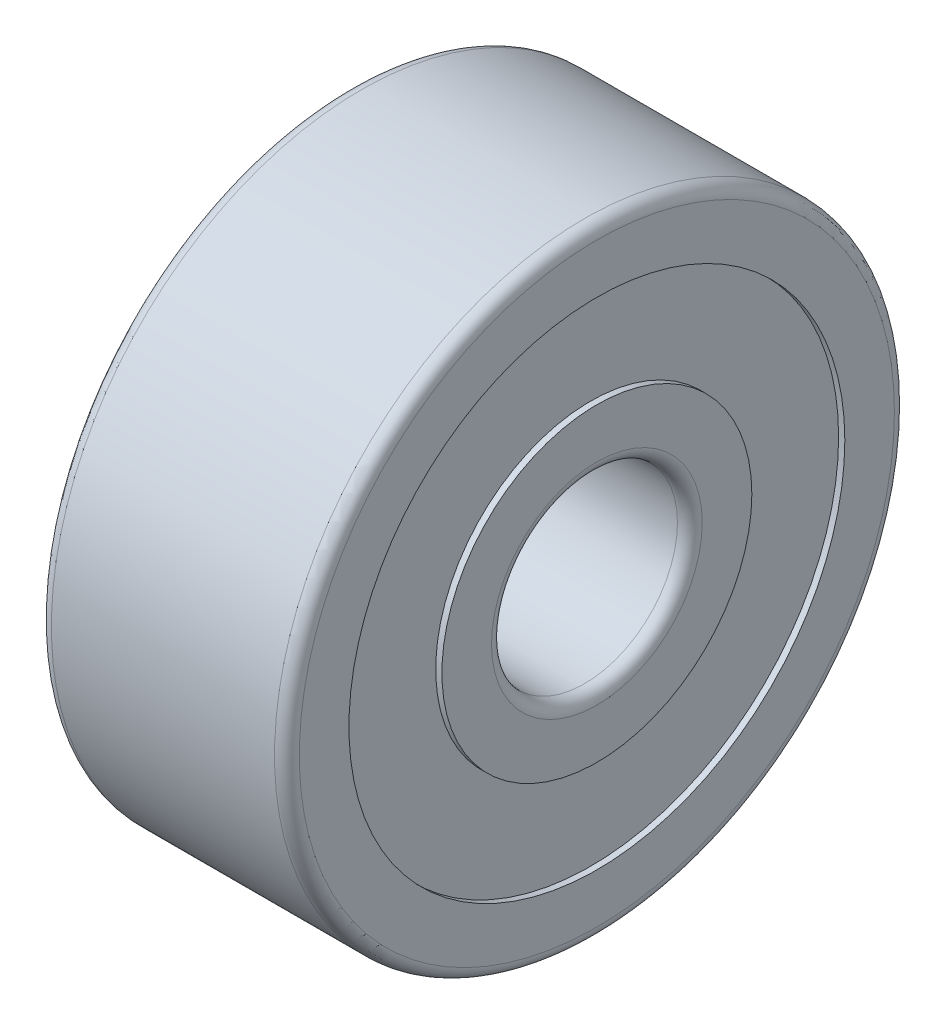
ISO-10303-21;
HEADER;
FILE_DESCRIPTION(('STEP AP214'),'2;1');
FILE_NAME('part.step','',(''),(''),'','','');
FILE_SCHEMA(('AUTOMOTIVE_DESIGN { 1 0 10303 214 1 1 1 1 }'));
ENDSEC;
DATA;
#1=APPLICATION_CONTEXT('core data for automotive mechanical design processes');
#2=APPLICATION_PROTOCOL_DEFINITION('international standard','automotive_design',2000,#1);
#3=PRODUCT_CONTEXT('',#1,'mechanical');
#4=PRODUCT('Part','Part','',(#3));
#5=PRODUCT_RELATED_PRODUCT_CATEGORY('part','',(#4));
#6=PRODUCT_DEFINITION_FORMATION('','',#4);
#7=PRODUCT_DEFINITION_CONTEXT('part definition',#1,'design');
#8=PRODUCT_DEFINITION('design','',#6,#7);
#9=PRODUCT_DEFINITION_SHAPE('','',#8);
#10=(LENGTH_UNIT() NAMED_UNIT(*) SI_UNIT(.MILLI.,.METRE.));
#11=(NAMED_UNIT(*) PLANE_ANGLE_UNIT() SI_UNIT($,.RADIAN.));
#12=(NAMED_UNIT(*) SI_UNIT($,.STERADIAN.) SOLID_ANGLE_UNIT());
#13=UNCERTAINTY_MEASURE_WITH_UNIT(LENGTH_MEASURE(1.E-05),#10,'distance_accuracy_value','');
#14=(GEOMETRIC_REPRESENTATION_CONTEXT(3) GLOBAL_UNCERTAINTY_ASSIGNED_CONTEXT((#13)) GLOBAL_UNIT_ASSIGNED_CONTEXT((#10,
#11,#12)) REPRESENTATION_CONTEXT('',''));
#15=CARTESIAN_POINT('',(0.,0.,0.));
#16=DIRECTION('',(0.,0.,1.));
#17=DIRECTION('',(1.,0.,0.));
#18=AXIS2_PLACEMENT_3D('',#15,#16,#17);
#19=CARTESIAN_POINT('',(-2.,0.,0.));
#20=DIRECTION('',(1.,0.,0.));
#21=DIRECTION('',(0.,0.,-1.));
#22=AXIS2_PLACEMENT_3D('',#19,#20,#21);
#23=PLANE('',#22);
#24=CARTESIAN_POINT('',(-2.,0.,0.));
#25=DIRECTION('',(1.,0.,0.));
#26=DIRECTION('',(0.,0.,-1.));
#27=AXIS2_PLACEMENT_3D('',#24,#25,#26);
#28=CIRCLE('',#27,1.7);
#29=CARTESIAN_POINT('',(-2.,0.,-1.7));
#30=VERTEX_POINT('',#29);
#31=EDGE_CURVE('E57',#30,#30,#28,.T.);
#32=ORIENTED_EDGE('',*,*,#31,.T.);
#33=EDGE_LOOP('',(#32));
#34=FACE_BOUND('',#33,.T.);
#35=CARTESIAN_POINT('',(-2.,0.,0.));
#36=DIRECTION('',(-1.,0.,0.));
#37=DIRECTION('',(0.,0.,1.));
#38=AXIS2_PLACEMENT_3D('',#35,#36,#37);
#39=CIRCLE('',#38,2.5);
#40=CARTESIAN_POINT('',(-2.,0.,2.5));
#41=VERTEX_POINT('',#40);
#42=EDGE_CURVE('E82',#41,#41,#39,.T.);
#43=ORIENTED_EDGE('',*,*,#42,.T.);
#44=EDGE_LOOP('',(#43));
#45=FACE_BOUND('',#44,.T.);
#46=ADVANCED_FACE('F31',(#34,#45),#23,.F.);
#47=CARTESIAN_POINT('',(2.,0.,0.));
#48=DIRECTION('',(1.,0.,0.));
#49=DIRECTION('',(0.,0.,-1.));
#50=AXIS2_PLACEMENT_3D('',#47,#48,#49);
#51=PLANE('',#50);
#52=CARTESIAN_POINT('',(2.,0.,0.));
#53=DIRECTION('',(1.,0.,0.));
#54=DIRECTION('',(0.,0.,-1.));
#55=AXIS2_PLACEMENT_3D('',#52,#53,#54);
#56=CIRCLE('',#55,1.7);
#57=CARTESIAN_POINT('',(2.,0.,-1.7));
#58=VERTEX_POINT('',#57);
#59=EDGE_CURVE('E42',#58,#58,#56,.F.);
#60=ORIENTED_EDGE('',*,*,#59,.T.);
#61=EDGE_LOOP('',(#60));
#62=FACE_BOUND('',#61,.T.);
#63=CARTESIAN_POINT('',(2.,0.,0.));
#64=DIRECTION('',(1.,0.,0.));
#65=DIRECTION('',(0.,0.,-1.));
#66=AXIS2_PLACEMENT_3D('',#63,#64,#65);
#67=CIRCLE('',#66,2.5);
#68=CARTESIAN_POINT('',(2.,0.,-2.5));
#69=VERTEX_POINT('',#68);
#70=EDGE_CURVE('E70',#69,#69,#67,.T.);
#71=ORIENTED_EDGE('',*,*,#70,.T.);
#72=EDGE_LOOP('',(#71));
#73=FACE_BOUND('',#72,.T.);
#74=ADVANCED_FACE('F126',(#62,#73),#51,.T.);
#75=CARTESIAN_POINT('',(-2.,0.,0.));
#76=DIRECTION('',(1.,0.,0.));
#77=DIRECTION('',(0.,0.,-1.));
#78=AXIS2_PLACEMENT_3D('',#75,#76,#77);
#79=CYLINDRICAL_SURFACE('',#78,5.);
#80=CARTESIAN_POINT('',(-1.8,0.,0.));
#81=DIRECTION('',(1.,0.,0.));
#82=DIRECTION('',(0.,0.,-1.));
#83=AXIS2_PLACEMENT_3D('',#80,#81,#82);
#84=CIRCLE('',#83,5.);
#85=CARTESIAN_POINT('',(-1.8,0.,-5.));
#86=VERTEX_POINT('',#85);
#87=EDGE_CURVE('E10',#86,#86,#84,.T.);
#88=ORIENTED_EDGE('',*,*,#87,.T.);
#89=EDGE_LOOP('',(#88));
#90=FACE_BOUND('',#89,.T.);
#91=CARTESIAN_POINT('',(1.8,0.,0.));
#92=DIRECTION('',(1.,0.,0.));
#93=DIRECTION('',(0.,0.,-1.));
#94=AXIS2_PLACEMENT_3D('',#91,#92,#93);
#95=CIRCLE('',#94,5.);
#96=CARTESIAN_POINT('',(1.8,0.,-5.));
#97=VERTEX_POINT('',#96);
#98=EDGE_CURVE('E38',#97,#97,#95,.F.);
#99=ORIENTED_EDGE('',*,*,#98,.T.);
#100=EDGE_LOOP('',(#99));
#101=FACE_BOUND('',#100,.T.);
#102=ADVANCED_FACE('F108',(#90,#101),#79,.T.);
#103=CARTESIAN_POINT('',(-2.,0.,0.));
#104=DIRECTION('',(-1.,0.,0.));
#105=DIRECTION('',(0.,0.,1.));
#106=AXIS2_PLACEMENT_3D('',#103,#104,#105);
#107=CIRCLE('',#106,4.);
#108=CARTESIAN_POINT('',(-2.,0.,4.));
#109=VERTEX_POINT('',#108);
#110=EDGE_CURVE('E76',#109,#109,#107,.T.);
#111=ORIENTED_EDGE('',*,*,#110,.F.);
#112=EDGE_LOOP('',(#111));
#113=FACE_BOUND('',#112,.T.);
#114=CARTESIAN_POINT('',(-2.,0.,0.));
#115=DIRECTION('',(1.,0.,0.));
#116=DIRECTION('',(0.,0.,-1.));
#117=AXIS2_PLACEMENT_3D('',#114,#115,#116);
#118=CIRCLE('',#117,4.8);
#119=CARTESIAN_POINT('',(-2.,0.,-4.8));
#120=VERTEX_POINT('',#119);
#121=EDGE_CURVE('E60',#120,#120,#118,.F.);
#122=ORIENTED_EDGE('',*,*,#121,.T.);
#123=EDGE_LOOP('',(#122));
#124=FACE_BOUND('',#123,.T.);
#125=ADVANCED_FACE('F104',(#113,#124),#23,.F.);
#126=CARTESIAN_POINT('',(-2.,0.,0.));
#127=DIRECTION('',(1.,0.,0.));
#128=DIRECTION('',(0.,0.,-1.));
#129=AXIS2_PLACEMENT_3D('',#126,#127,#128);
#130=CYLINDRICAL_SURFACE('',#129,1.5);
#131=CARTESIAN_POINT('',(-1.8,0.,0.));
#132=DIRECTION('',(1.,0.,0.));
#133=DIRECTION('',(0.,0.,-1.));
#134=AXIS2_PLACEMENT_3D('',#131,#132,#133);
#135=CIRCLE('',#134,1.5);
#136=CARTESIAN_POINT('',(-1.8,0.,-1.5));
#137=VERTEX_POINT('',#136);
#138=EDGE_CURVE('E51',#137,#137,#135,.F.);
#139=ORIENTED_EDGE('',*,*,#138,.T.);
#140=EDGE_LOOP('',(#139));
#141=FACE_BOUND('',#140,.T.);
#142=CARTESIAN_POINT('',(1.8,0.,0.));
#143=DIRECTION('',(1.,0.,0.));
#144=DIRECTION('',(0.,0.,-1.));
#145=AXIS2_PLACEMENT_3D('',#142,#143,#144);
#146=CIRCLE('',#145,1.5);
#147=CARTESIAN_POINT('',(1.8,0.,-1.5));
#148=VERTEX_POINT('',#147);
#149=EDGE_CURVE('E54',#148,#148,#146,.T.);
#150=ORIENTED_EDGE('',*,*,#149,.T.);
#151=EDGE_LOOP('',(#150));
#152=FACE_BOUND('',#151,.T.);
#153=ADVANCED_FACE('F107',(#141,#152),#130,.F.);
#154=CARTESIAN_POINT('',(2.,0.,0.));
#155=DIRECTION('',(1.,0.,0.));
#156=DIRECTION('',(0.,0.,-1.));
#157=AXIS2_PLACEMENT_3D('',#154,#155,#156);
#158=CIRCLE('',#157,4.);
#159=CARTESIAN_POINT('',(2.,0.,-4.));
#160=VERTEX_POINT('',#159);
#161=EDGE_CURVE('E64',#160,#160,#158,.T.);
#162=ORIENTED_EDGE('',*,*,#161,.F.);
#163=EDGE_LOOP('',(#162));
#164=FACE_BOUND('',#163,.T.);
#165=CARTESIAN_POINT('',(2.,0.,0.));
#166=DIRECTION('',(1.,0.,0.));
#167=DIRECTION('',(0.,0.,-1.));
#168=AXIS2_PLACEMENT_3D('',#165,#166,#167);
#169=CIRCLE('',#168,4.8);
#170=CARTESIAN_POINT('',(2.,0.,-4.8));
#171=VERTEX_POINT('',#170);
#172=EDGE_CURVE('E46',#171,#171,#169,.T.);
#173=ORIENTED_EDGE('',*,*,#172,.T.);
#174=EDGE_LOOP('',(#173));
#175=FACE_BOUND('',#174,.T.);
#176=ADVANCED_FACE('F133',(#164,#175),#51,.T.);
#177=CARTESIAN_POINT('',(-1.8,0.,0.));
#178=DIRECTION('',(1.,0.,0.));
#179=DIRECTION('',(0.,0.,-1.));
#180=AXIS2_PLACEMENT_3D('',#177,#178,#179);
#181=TOROIDAL_SURFACE('',#180,1.7,0.2);
#182=ORIENTED_EDGE('',*,*,#138,.F.);
#183=EDGE_LOOP('',(#182));
#184=FACE_BOUND('',#183,.T.);
#185=ORIENTED_EDGE('',*,*,#31,.F.);
#186=EDGE_LOOP('',(#185));
#187=FACE_BOUND('',#186,.T.);
#188=ADVANCED_FACE('F122',(#184,#187),#181,.T.);
#189=CARTESIAN_POINT('',(1.8,0.,0.));
#190=DIRECTION('',(1.,0.,0.));
#191=DIRECTION('',(0.,0.,-1.));
#192=AXIS2_PLACEMENT_3D('',#189,#190,#191);
#193=TOROIDAL_SURFACE('',#192,1.7,0.2);
#194=ORIENTED_EDGE('',*,*,#59,.F.);
#195=EDGE_LOOP('',(#194));
#196=FACE_BOUND('',#195,.T.);
#197=ORIENTED_EDGE('',*,*,#149,.F.);
#198=EDGE_LOOP('',(#197));
#199=FACE_BOUND('',#198,.T.);
#200=ADVANCED_FACE('F115',(#196,#199),#193,.T.);
#201=CARTESIAN_POINT('',(-1.8,0.,0.));
#202=DIRECTION('',(1.,0.,0.));
#203=DIRECTION('',(0.,0.,-1.));
#204=AXIS2_PLACEMENT_3D('',#201,#202,#203);
#205=TOROIDAL_SURFACE('',#204,4.8,0.2);
#206=ORIENTED_EDGE('',*,*,#121,.F.);
#207=EDGE_LOOP('',(#206));
#208=FACE_BOUND('',#207,.T.);
#209=ORIENTED_EDGE('',*,*,#87,.F.);
#210=EDGE_LOOP('',(#209));
#211=FACE_BOUND('',#210,.T.);
#212=ADVANCED_FACE('F112',(#208,#211),#205,.T.);
#213=CARTESIAN_POINT('',(1.8,0.,0.));
#214=DIRECTION('',(1.,0.,0.));
#215=DIRECTION('',(0.,0.,-1.));
#216=AXIS2_PLACEMENT_3D('',#213,#214,#215);
#217=TOROIDAL_SURFACE('',#216,4.8,0.2);
#218=ORIENTED_EDGE('',*,*,#98,.F.);
#219=EDGE_LOOP('',(#218));
#220=FACE_BOUND('',#219,.T.);
#221=ORIENTED_EDGE('',*,*,#172,.F.);
#222=EDGE_LOOP('',(#221));
#223=FACE_BOUND('',#222,.T.);
#224=ADVANCED_FACE('F33',(#220,#223),#217,.T.);
#225=CARTESIAN_POINT('',(1.9,0.,0.));
#226=DIRECTION('',(1.,0.,0.));
#227=DIRECTION('',(0.,0.,-1.));
#228=AXIS2_PLACEMENT_3D('',#225,#226,#227);
#229=CYLINDRICAL_SURFACE('',#228,4.);
#230=CARTESIAN_POINT('',(1.9,0.,0.));
#231=DIRECTION('',(1.,0.,0.));
#232=DIRECTION('',(0.,0.,-1.));
#233=AXIS2_PLACEMENT_3D('',#230,#231,#232);
#234=CIRCLE('',#233,4.);
#235=CARTESIAN_POINT('',(1.9,0.,-4.));
#236=VERTEX_POINT('',#235);
#237=EDGE_CURVE('E63',#236,#236,#234,.T.);
#238=ORIENTED_EDGE('',*,*,#237,.F.);
#239=EDGE_LOOP('',(#238));
#240=FACE_BOUND('',#239,.T.);
#241=ORIENTED_EDGE('',*,*,#161,.T.);
#242=EDGE_LOOP('',(#241));
#243=FACE_BOUND('',#242,.T.);
#244=ADVANCED_FACE('F120',(#240,#243),#229,.F.);
#245=CARTESIAN_POINT('',(1.9,0.,0.));
#246=DIRECTION('',(1.,0.,0.));
#247=DIRECTION('',(0.,0.,-1.));
#248=AXIS2_PLACEMENT_3D('',#245,#246,#247);
#249=PLANE('',#248);
#250=CARTESIAN_POINT('',(1.9,0.,0.));
#251=DIRECTION('',(1.,0.,0.));
#252=DIRECTION('',(0.,0.,-1.));
#253=AXIS2_PLACEMENT_3D('',#250,#251,#252);
#254=CIRCLE('',#253,2.5);
#255=CARTESIAN_POINT('',(1.9,0.,-2.5));
#256=VERTEX_POINT('',#255);
#257=EDGE_CURVE('E67',#256,#256,#254,.T.);
#258=ORIENTED_EDGE('',*,*,#257,.F.);
#259=EDGE_LOOP('',(#258));
#260=FACE_BOUND('',#259,.T.);
#261=ORIENTED_EDGE('',*,*,#237,.T.);
#262=EDGE_LOOP('',(#261));
#263=FACE_BOUND('',#262,.T.);
#264=ADVANCED_FACE('F176',(#260,#263),#249,.T.);
#265=CARTESIAN_POINT('',(1.9,0.,0.));
#266=DIRECTION('',(1.,0.,0.));
#267=DIRECTION('',(0.,0.,-1.));
#268=AXIS2_PLACEMENT_3D('',#265,#266,#267);
#269=CYLINDRICAL_SURFACE('',#268,2.5);
#270=ORIENTED_EDGE('',*,*,#257,.T.);
#271=EDGE_LOOP('',(#270));
#272=FACE_BOUND('',#271,.T.);
#273=ORIENTED_EDGE('',*,*,#70,.F.);
#274=EDGE_LOOP('',(#273));
#275=FACE_BOUND('',#274,.T.);
#276=ADVANCED_FACE('F100',(#272,#275),#269,.T.);
#277=CARTESIAN_POINT('',(-1.9,0.,0.));
#278=DIRECTION('',(-1.,0.,0.));
#279=DIRECTION('',(0.,0.,1.));
#280=AXIS2_PLACEMENT_3D('',#277,#278,#279);
#281=CYLINDRICAL_SURFACE('',#280,4.);
#282=CARTESIAN_POINT('',(-1.9,0.,0.));
#283=DIRECTION('',(-1.,0.,0.));
#284=DIRECTION('',(0.,0.,1.));
#285=AXIS2_PLACEMENT_3D('',#282,#283,#284);
#286=CIRCLE('',#285,4.);
#287=CARTESIAN_POINT('',(-1.9,0.,4.));
#288=VERTEX_POINT('',#287);
#289=EDGE_CURVE('E73',#288,#288,#286,.T.);
#290=ORIENTED_EDGE('',*,*,#289,.F.);
#291=EDGE_LOOP('',(#290));
#292=FACE_BOUND('',#291,.T.);
#293=ORIENTED_EDGE('',*,*,#110,.T.);
#294=EDGE_LOOP('',(#293));
#295=FACE_BOUND('',#294,.T.);
#296=ADVANCED_FACE('F94',(#292,#295),#281,.F.);
#297=CARTESIAN_POINT('',(-1.9,0.,0.));
#298=DIRECTION('',(-1.,0.,0.));
#299=DIRECTION('',(0.,0.,1.));
#300=AXIS2_PLACEMENT_3D('',#297,#298,#299);
#301=PLANE('',#300);
#302=CARTESIAN_POINT('',(-1.9,0.,0.));
#303=DIRECTION('',(-1.,0.,0.));
#304=DIRECTION('',(0.,0.,1.));
#305=AXIS2_PLACEMENT_3D('',#302,#303,#304);
#306=CIRCLE('',#305,2.5);
#307=CARTESIAN_POINT('',(-1.9,0.,2.5));
#308=VERTEX_POINT('',#307);
#309=EDGE_CURVE('E79',#308,#308,#306,.T.);
#310=ORIENTED_EDGE('',*,*,#309,.F.);
#311=EDGE_LOOP('',(#310));
#312=FACE_BOUND('',#311,.T.);
#313=ORIENTED_EDGE('',*,*,#289,.T.);
#314=EDGE_LOOP('',(#313));
#315=FACE_BOUND('',#314,.T.);
#316=ADVANCED_FACE('F91',(#312,#315),#301,.T.);
#317=CARTESIAN_POINT('',(-1.9,0.,0.));
#318=DIRECTION('',(-1.,0.,0.));
#319=DIRECTION('',(0.,0.,1.));
#320=AXIS2_PLACEMENT_3D('',#317,#318,#319);
#321=CYLINDRICAL_SURFACE('',#320,2.5);
#322=ORIENTED_EDGE('',*,*,#309,.T.);
#323=EDGE_LOOP('',(#322));
#324=FACE_BOUND('',#323,.T.);
#325=ORIENTED_EDGE('',*,*,#42,.F.);
#326=EDGE_LOOP('',(#325));
#327=FACE_BOUND('',#326,.T.);
#328=ADVANCED_FACE('F88',(#324,#327),#321,.T.);
#329=CLOSED_SHELL('',(#46,#74,#102,#125,#153,#176,#188,#200,#212,#224,#244,#264,#276,#296,#316,#328));
#330=MANIFOLD_SOLID_BREP('B2',#329);
#331=ADVANCED_BREP_SHAPE_REPRESENTATION('',(#18,#330),#14);
#332=SHAPE_DEFINITION_REPRESENTATION(#9,#331);
ENDSEC;
END-ISO-10303-21;
